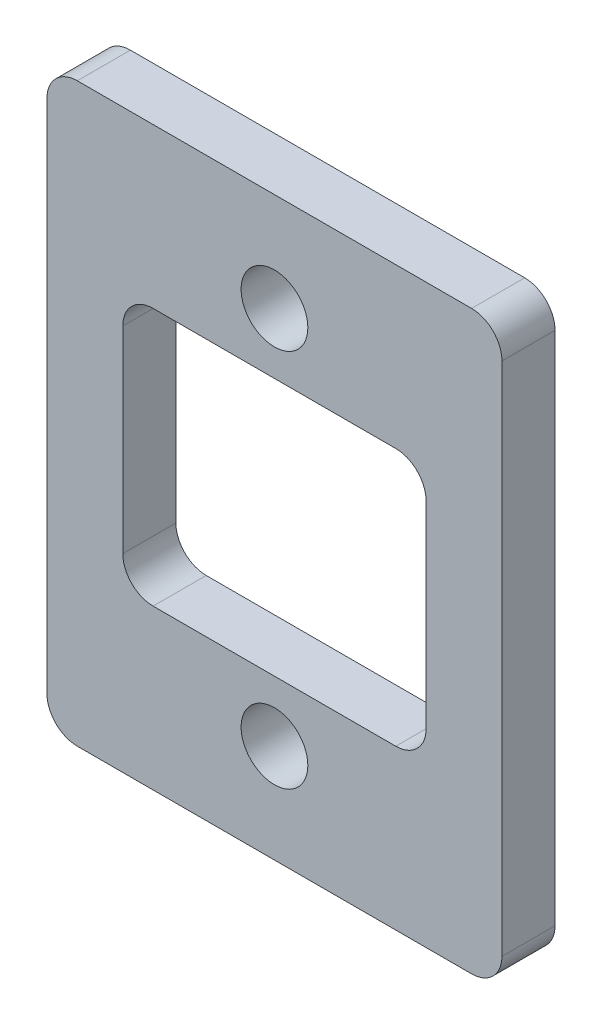
ISO-10303-21;
HEADER;
FILE_DESCRIPTION(('STEP AP214'),'2;1');
FILE_NAME('part.step','',(''),(''),'','','');
FILE_SCHEMA(('AUTOMOTIVE_DESIGN { 1 0 10303 214 1 1 1 1 }'));
ENDSEC;
DATA;
#1=APPLICATION_CONTEXT('core data for automotive mechanical design processes');
#2=APPLICATION_PROTOCOL_DEFINITION('international standard','automotive_design',2000,#1);
#3=PRODUCT_CONTEXT('',#1,'mechanical');
#4=PRODUCT('Part','Part','',(#3));
#5=PRODUCT_RELATED_PRODUCT_CATEGORY('part','',(#4));
#6=PRODUCT_DEFINITION_FORMATION('','',#4);
#7=PRODUCT_DEFINITION_CONTEXT('part definition',#1,'design');
#8=PRODUCT_DEFINITION('design','',#6,#7);
#9=PRODUCT_DEFINITION_SHAPE('','',#8);
#10=(LENGTH_UNIT() NAMED_UNIT(*) SI_UNIT(.MILLI.,.METRE.));
#11=(NAMED_UNIT(*) PLANE_ANGLE_UNIT() SI_UNIT($,.RADIAN.));
#12=(NAMED_UNIT(*) SI_UNIT($,.STERADIAN.) SOLID_ANGLE_UNIT());
#13=UNCERTAINTY_MEASURE_WITH_UNIT(LENGTH_MEASURE(1.E-05),#10,'distance_accuracy_value','');
#14=(GEOMETRIC_REPRESENTATION_CONTEXT(3) GLOBAL_UNCERTAINTY_ASSIGNED_CONTEXT((#13)) GLOBAL_UNIT_ASSIGNED_CONTEXT((#10,
#11,#12)) REPRESENTATION_CONTEXT('',''));
#15=CARTESIAN_POINT('',(0.,0.,0.));
#16=DIRECTION('',(0.,0.,1.));
#17=DIRECTION('',(1.,0.,0.));
#18=AXIS2_PLACEMENT_3D('',#15,#16,#17);
#19=CARTESIAN_POINT('',(0.,0.,3.5));
#20=DIRECTION('',(0.,0.,-1.));
#21=DIRECTION('',(-1.,0.,0.));
#22=AXIS2_PLACEMENT_3D('',#19,#20,#21);
#23=PLANE('',#22);
#24=DIRECTION('',(-1.,0.,0.));
#25=VECTOR('',#24,1.);
#26=CARTESIAN_POINT('',(-10.,8.5,3.5));
#27=LINE('',#26,#25);
#28=CARTESIAN_POINT('',(8.,8.5,3.5));
#29=VERTEX_POINT('',#28);
#30=CARTESIAN_POINT('',(-8.,8.5,3.5));
#31=VERTEX_POINT('',#30);
#32=EDGE_CURVE('E294',#29,#31,#27,.T.);
#33=ORIENTED_EDGE('',*,*,#32,.F.);
#34=CARTESIAN_POINT('',(8.,6.5,3.5));
#35=DIRECTION('',(0.,0.,-1.));
#36=DIRECTION('',(-1.,0.,0.));
#37=AXIS2_PLACEMENT_3D('',#34,#35,#36);
#38=CIRCLE('',#37,2.);
#39=CARTESIAN_POINT('',(10.,6.5,3.5));
#40=VERTEX_POINT('',#39);
#41=EDGE_CURVE('E252',#29,#40,#38,.T.);
#42=ORIENTED_EDGE('',*,*,#41,.T.);
#43=DIRECTION('',(0.,1.,0.));
#44=VECTOR('',#43,1.);
#45=CARTESIAN_POINT('',(10.,-8.5,3.5));
#46=LINE('',#45,#44);
#47=CARTESIAN_POINT('',(10.,-6.5,3.5));
#48=VERTEX_POINT('',#47);
#49=EDGE_CURVE('E266',#48,#40,#46,.T.);
#50=ORIENTED_EDGE('',*,*,#49,.F.);
#51=CARTESIAN_POINT('',(8.,-6.5,3.5));
#52=DIRECTION('',(0.,0.,-1.));
#53=DIRECTION('',(-1.,0.,0.));
#54=AXIS2_PLACEMENT_3D('',#51,#52,#53);
#55=CIRCLE('',#54,2.);
#56=CARTESIAN_POINT('',(8.,-8.5,3.5));
#57=VERTEX_POINT('',#56);
#58=EDGE_CURVE('E43',#48,#57,#55,.T.);
#59=ORIENTED_EDGE('',*,*,#58,.T.);
#60=DIRECTION('',(1.,0.,0.));
#61=VECTOR('',#60,1.);
#62=CARTESIAN_POINT('',(-9.99999999999999,-8.5,3.5));
#63=LINE('',#62,#61);
#64=CARTESIAN_POINT('',(-7.99999999999999,-8.5,3.5));
#65=VERTEX_POINT('',#64);
#66=EDGE_CURVE('E264',#65,#57,#63,.T.);
#67=ORIENTED_EDGE('',*,*,#66,.F.);
#68=CARTESIAN_POINT('',(-7.99999999999999,-6.5,3.5));
#69=DIRECTION('',(0.,0.,-1.));
#70=DIRECTION('',(-1.,0.,0.));
#71=AXIS2_PLACEMENT_3D('',#68,#69,#70);
#72=CIRCLE('',#71,2.);
#73=CARTESIAN_POINT('',(-9.99999999999999,-6.5,3.5));
#74=VERTEX_POINT('',#73);
#75=EDGE_CURVE('E256',#65,#74,#72,.T.);
#76=ORIENTED_EDGE('',*,*,#75,.T.);
#77=DIRECTION('',(0.,-1.,0.));
#78=VECTOR('',#77,1.);
#79=CARTESIAN_POINT('',(-9.99999999999999,-8.5,3.5));
#80=LINE('',#79,#78);
#81=CARTESIAN_POINT('',(-10.,6.5,3.5));
#82=VERTEX_POINT('',#81);
#83=EDGE_CURVE('E275',#82,#74,#80,.T.);
#84=ORIENTED_EDGE('',*,*,#83,.F.);
#85=CARTESIAN_POINT('',(-8.,6.5,3.5));
#86=DIRECTION('',(0.,0.,-1.));
#87=DIRECTION('',(-1.,0.,0.));
#88=AXIS2_PLACEMENT_3D('',#85,#86,#87);
#89=CIRCLE('',#88,2.);
#90=EDGE_CURVE('E248',#82,#31,#89,.T.);
#91=ORIENTED_EDGE('',*,*,#90,.T.);
#92=EDGE_LOOP('',(#33,#42,#50,#59,#67,#76,#84,#91));
#93=FACE_BOUND('',#92,.T.);
#94=DIRECTION('',(1.,0.,0.));
#95=VECTOR('',#94,1.);
#96=CARTESIAN_POINT('',(-15.,-19.,3.5));
#97=LINE('',#96,#95);
#98=CARTESIAN_POINT('',(-13.,-19.,3.5));
#99=VERTEX_POINT('',#98);
#100=CARTESIAN_POINT('',(13.,-19.,3.5));
#101=VERTEX_POINT('',#100);
#102=EDGE_CURVE('E186',#99,#101,#97,.T.);
#103=ORIENTED_EDGE('',*,*,#102,.T.);
#104=CARTESIAN_POINT('',(13.,-17.,3.5));
#105=DIRECTION('',(0.,0.,-1.));
#106=DIRECTION('',(-1.,0.,0.));
#107=AXIS2_PLACEMENT_3D('',#104,#105,#106);
#108=CIRCLE('',#107,2.);
#109=CARTESIAN_POINT('',(15.,-17.,3.5));
#110=VERTEX_POINT('',#109);
#111=EDGE_CURVE('E217',#101,#110,#108,.F.);
#112=ORIENTED_EDGE('',*,*,#111,.T.);
#113=DIRECTION('',(0.,1.,0.));
#114=VECTOR('',#113,1.);
#115=CARTESIAN_POINT('',(15.,-19.,3.5));
#116=LINE('',#115,#114);
#117=CARTESIAN_POINT('',(15.,17.,3.5));
#118=VERTEX_POINT('',#117);
#119=EDGE_CURVE('E169',#110,#118,#116,.T.);
#120=ORIENTED_EDGE('',*,*,#119,.T.);
#121=CARTESIAN_POINT('',(13.,17.,3.5));
#122=DIRECTION('',(0.,0.,-1.));
#123=DIRECTION('',(-1.,0.,0.));
#124=AXIS2_PLACEMENT_3D('',#121,#122,#123);
#125=CIRCLE('',#124,2.);
#126=CARTESIAN_POINT('',(13.,19.,3.5));
#127=VERTEX_POINT('',#126);
#128=EDGE_CURVE('E212',#118,#127,#125,.F.);
#129=ORIENTED_EDGE('',*,*,#128,.T.);
#130=DIRECTION('',(-1.,0.,0.));
#131=VECTOR('',#130,1.);
#132=CARTESIAN_POINT('',(-15.,19.,3.5));
#133=LINE('',#132,#131);
#134=CARTESIAN_POINT('',(-13.,19.,3.5));
#135=VERTEX_POINT('',#134);
#136=EDGE_CURVE('E319',#127,#135,#133,.T.);
#137=ORIENTED_EDGE('',*,*,#136,.T.);
#138=CARTESIAN_POINT('',(-13.,17.,3.5));
#139=DIRECTION('',(0.,0.,-1.));
#140=DIRECTION('',(-1.,0.,0.));
#141=AXIS2_PLACEMENT_3D('',#138,#139,#140);
#142=CIRCLE('',#141,2.);
#143=CARTESIAN_POINT('',(-15.,17.,3.5));
#144=VERTEX_POINT('',#143);
#145=EDGE_CURVE('E57',#135,#144,#142,.F.);
#146=ORIENTED_EDGE('',*,*,#145,.T.);
#147=DIRECTION('',(0.,-1.,0.));
#148=VECTOR('',#147,1.);
#149=CARTESIAN_POINT('',(-15.,-19.,3.5));
#150=LINE('',#149,#148);
#151=CARTESIAN_POINT('',(-15.,-17.,3.5));
#152=VERTEX_POINT('',#151);
#153=EDGE_CURVE('E320',#144,#152,#150,.T.);
#154=ORIENTED_EDGE('',*,*,#153,.T.);
#155=CARTESIAN_POINT('',(-13.,-17.,3.5));
#156=DIRECTION('',(0.,0.,-1.));
#157=DIRECTION('',(-1.,0.,0.));
#158=AXIS2_PLACEMENT_3D('',#155,#156,#157);
#159=CIRCLE('',#158,2.);
#160=EDGE_CURVE('E215',#152,#99,#159,.F.);
#161=ORIENTED_EDGE('',*,*,#160,.T.);
#162=EDGE_LOOP('',(#103,#112,#120,#129,#137,#146,#154,#161));
#163=FACE_BOUND('',#162,.T.);
#164=CARTESIAN_POINT('',(0.,12.5,3.5));
#165=DIRECTION('',(0.,0.,1.));
#166=DIRECTION('',(1.,0.,0.));
#167=AXIS2_PLACEMENT_3D('',#164,#165,#166);
#168=CIRCLE('',#167,2.2);
#169=CARTESIAN_POINT('',(2.2,12.5,3.5));
#170=VERTEX_POINT('',#169);
#171=EDGE_CURVE('E177',#170,#170,#168,.T.);
#172=ORIENTED_EDGE('',*,*,#171,.F.);
#173=EDGE_LOOP('',(#172));
#174=FACE_BOUND('',#173,.T.);
#175=CARTESIAN_POINT('',(0.,-12.5,3.5));
#176=DIRECTION('',(0.,0.,1.));
#177=DIRECTION('',(1.,0.,0.));
#178=AXIS2_PLACEMENT_3D('',#175,#176,#177);
#179=CIRCLE('',#178,2.2);
#180=CARTESIAN_POINT('',(2.2,-12.5,3.5));
#181=VERTEX_POINT('',#180);
#182=EDGE_CURVE('E311',#181,#181,#179,.T.);
#183=ORIENTED_EDGE('',*,*,#182,.F.);
#184=EDGE_LOOP('',(#183));
#185=FACE_BOUND('',#184,.T.);
#186=ADVANCED_FACE('F35',(#93,#163,#174,#185),#23,.F.);
#187=CARTESIAN_POINT('',(0.,0.,0.));
#188=DIRECTION('',(0.,0.,-1.));
#189=DIRECTION('',(-1.,0.,0.));
#190=AXIS2_PLACEMENT_3D('',#187,#188,#189);
#191=PLANE('',#190);
#192=DIRECTION('',(0.,-1.,0.));
#193=VECTOR('',#192,1.);
#194=CARTESIAN_POINT('',(10.,0.,0.));
#195=LINE('',#194,#193);
#196=CARTESIAN_POINT('',(10.,6.5,0.));
#197=VERTEX_POINT('',#196);
#198=CARTESIAN_POINT('',(10.,-6.5,0.));
#199=VERTEX_POINT('',#198);
#200=EDGE_CURVE('E201',#197,#199,#195,.T.);
#201=ORIENTED_EDGE('',*,*,#200,.F.);
#202=CARTESIAN_POINT('',(8.,6.5,0.));
#203=DIRECTION('',(0.,0.,-1.));
#204=DIRECTION('',(-1.,0.,0.));
#205=AXIS2_PLACEMENT_3D('',#202,#203,#204);
#206=CIRCLE('',#205,2.);
#207=CARTESIAN_POINT('',(8.,8.5,0.));
#208=VERTEX_POINT('',#207);
#209=EDGE_CURVE('E254',#197,#208,#206,.F.);
#210=ORIENTED_EDGE('',*,*,#209,.T.);
#211=DIRECTION('',(1.,0.,0.));
#212=VECTOR('',#211,1.);
#213=CARTESIAN_POINT('',(0.,8.5,0.));
#214=LINE('',#213,#212);
#215=CARTESIAN_POINT('',(-8.,8.5,0.));
#216=VERTEX_POINT('',#215);
#217=EDGE_CURVE('E192',#216,#208,#214,.T.);
#218=ORIENTED_EDGE('',*,*,#217,.F.);
#219=CARTESIAN_POINT('',(-8.,6.5,0.));
#220=DIRECTION('',(0.,0.,-1.));
#221=DIRECTION('',(-1.,0.,0.));
#222=AXIS2_PLACEMENT_3D('',#219,#220,#221);
#223=CIRCLE('',#222,2.);
#224=CARTESIAN_POINT('',(-10.,6.5,0.));
#225=VERTEX_POINT('',#224);
#226=EDGE_CURVE('E250',#216,#225,#223,.F.);
#227=ORIENTED_EDGE('',*,*,#226,.T.);
#228=DIRECTION('',(0.,1.,0.));
#229=VECTOR('',#228,1.);
#230=CARTESIAN_POINT('',(-10.,0.,0.));
#231=LINE('',#230,#229);
#232=CARTESIAN_POINT('',(-9.99999999999999,-6.5,0.));
#233=VERTEX_POINT('',#232);
#234=EDGE_CURVE('E195',#233,#225,#231,.T.);
#235=ORIENTED_EDGE('',*,*,#234,.F.);
#236=CARTESIAN_POINT('',(-7.99999999999999,-6.5,0.));
#237=DIRECTION('',(0.,0.,-1.));
#238=DIRECTION('',(-1.,0.,0.));
#239=AXIS2_PLACEMENT_3D('',#236,#237,#238);
#240=CIRCLE('',#239,2.);
#241=CARTESIAN_POINT('',(-7.99999999999999,-8.5,0.));
#242=VERTEX_POINT('',#241);
#243=EDGE_CURVE('E258',#233,#242,#240,.F.);
#244=ORIENTED_EDGE('',*,*,#243,.T.);
#245=DIRECTION('',(-1.,0.,0.));
#246=VECTOR('',#245,1.);
#247=CARTESIAN_POINT('',(0.,-8.5,0.));
#248=LINE('',#247,#246);
#249=CARTESIAN_POINT('',(8.,-8.5,0.));
#250=VERTEX_POINT('',#249);
#251=EDGE_CURVE('E198',#250,#242,#248,.T.);
#252=ORIENTED_EDGE('',*,*,#251,.F.);
#253=CARTESIAN_POINT('',(8.,-6.5,0.));
#254=DIRECTION('',(0.,0.,-1.));
#255=DIRECTION('',(-1.,0.,0.));
#256=AXIS2_PLACEMENT_3D('',#253,#254,#255);
#257=CIRCLE('',#256,2.);
#258=EDGE_CURVE('E11',#250,#199,#257,.F.);
#259=ORIENTED_EDGE('',*,*,#258,.T.);
#260=EDGE_LOOP('',(#201,#210,#218,#227,#235,#244,#252,#259));
#261=FACE_BOUND('',#260,.T.);
#262=CARTESIAN_POINT('',(0.,12.5,0.));
#263=DIRECTION('',(0.,0.,1.));
#264=DIRECTION('',(1.,0.,0.));
#265=AXIS2_PLACEMENT_3D('',#262,#263,#264);
#266=CIRCLE('',#265,2.2);
#267=CARTESIAN_POINT('',(2.2,12.5,0.));
#268=VERTEX_POINT('',#267);
#269=EDGE_CURVE('E183',#268,#268,#266,.T.);
#270=ORIENTED_EDGE('',*,*,#269,.T.);
#271=EDGE_LOOP('',(#270));
#272=FACE_BOUND('',#271,.T.);
#273=DIRECTION('',(0.,1.,0.));
#274=VECTOR('',#273,1.);
#275=CARTESIAN_POINT('',(15.,-19.,0.));
#276=LINE('',#275,#274);
#277=CARTESIAN_POINT('',(15.,-17.,0.));
#278=VERTEX_POINT('',#277);
#279=CARTESIAN_POINT('',(15.,17.,0.));
#280=VERTEX_POINT('',#279);
#281=EDGE_CURVE('E166',#278,#280,#276,.T.);
#282=ORIENTED_EDGE('',*,*,#281,.F.);
#283=CARTESIAN_POINT('',(13.,-17.,0.));
#284=DIRECTION('',(0.,0.,-1.));
#285=DIRECTION('',(-1.,0.,0.));
#286=AXIS2_PLACEMENT_3D('',#283,#284,#285);
#287=CIRCLE('',#286,2.);
#288=CARTESIAN_POINT('',(13.,-19.,0.));
#289=VERTEX_POINT('',#288);
#290=EDGE_CURVE('E149',#278,#289,#287,.T.);
#291=ORIENTED_EDGE('',*,*,#290,.T.);
#292=DIRECTION('',(1.,0.,0.));
#293=VECTOR('',#292,1.);
#294=CARTESIAN_POINT('',(-15.,-19.,0.));
#295=LINE('',#294,#293);
#296=CARTESIAN_POINT('',(-13.,-19.,0.));
#297=VERTEX_POINT('',#296);
#298=EDGE_CURVE('E190',#297,#289,#295,.T.);
#299=ORIENTED_EDGE('',*,*,#298,.F.);
#300=CARTESIAN_POINT('',(-13.,-17.,0.));
#301=DIRECTION('',(0.,0.,-1.));
#302=DIRECTION('',(-1.,0.,0.));
#303=AXIS2_PLACEMENT_3D('',#300,#301,#302);
#304=CIRCLE('',#303,2.);
#305=CARTESIAN_POINT('',(-15.,-17.,0.));
#306=VERTEX_POINT('',#305);
#307=EDGE_CURVE('E160',#297,#306,#304,.T.);
#308=ORIENTED_EDGE('',*,*,#307,.T.);
#309=DIRECTION('',(0.,-1.,0.));
#310=VECTOR('',#309,1.);
#311=CARTESIAN_POINT('',(-15.,-19.,0.));
#312=LINE('',#311,#310);
#313=CARTESIAN_POINT('',(-15.,17.,0.));
#314=VERTEX_POINT('',#313);
#315=EDGE_CURVE('E180',#314,#306,#312,.T.);
#316=ORIENTED_EDGE('',*,*,#315,.F.);
#317=CARTESIAN_POINT('',(-13.,17.,0.));
#318=DIRECTION('',(0.,0.,-1.));
#319=DIRECTION('',(-1.,0.,0.));
#320=AXIS2_PLACEMENT_3D('',#317,#318,#319);
#321=CIRCLE('',#320,2.);
#322=CARTESIAN_POINT('',(-13.,19.,0.));
#323=VERTEX_POINT('',#322);
#324=EDGE_CURVE('E206',#314,#323,#321,.T.);
#325=ORIENTED_EDGE('',*,*,#324,.T.);
#326=DIRECTION('',(-1.,0.,0.));
#327=VECTOR('',#326,1.);
#328=CARTESIAN_POINT('',(-15.,19.,0.));
#329=LINE('',#328,#327);
#330=CARTESIAN_POINT('',(13.,19.,0.));
#331=VERTEX_POINT('',#330);
#332=EDGE_CURVE('E176',#331,#323,#329,.T.);
#333=ORIENTED_EDGE('',*,*,#332,.F.);
#334=CARTESIAN_POINT('',(13.,17.,0.));
#335=DIRECTION('',(0.,0.,-1.));
#336=DIRECTION('',(-1.,0.,0.));
#337=AXIS2_PLACEMENT_3D('',#334,#335,#336);
#338=CIRCLE('',#337,2.);
#339=EDGE_CURVE('E170',#331,#280,#338,.T.);
#340=ORIENTED_EDGE('',*,*,#339,.T.);
#341=EDGE_LOOP('',(#282,#291,#299,#308,#316,#325,#333,#340));
#342=FACE_BOUND('',#341,.T.);
#343=CARTESIAN_POINT('',(0.,-12.5,0.));
#344=DIRECTION('',(0.,0.,1.));
#345=DIRECTION('',(1.,0.,0.));
#346=AXIS2_PLACEMENT_3D('',#343,#344,#345);
#347=CIRCLE('',#346,2.2);
#348=CARTESIAN_POINT('',(2.2,-12.5,0.));
#349=VERTEX_POINT('',#348);
#350=EDGE_CURVE('E274',#349,#349,#347,.T.);
#351=ORIENTED_EDGE('',*,*,#350,.T.);
#352=EDGE_LOOP('',(#351));
#353=FACE_BOUND('',#352,.T.);
#354=ADVANCED_FACE('F173',(#261,#272,#342,#353),#191,.T.);
#355=CARTESIAN_POINT('',(15.,-19.,3.5));
#356=DIRECTION('',(-1.,0.,0.));
#357=DIRECTION('',(0.,0.,1.));
#358=AXIS2_PLACEMENT_3D('',#355,#356,#357);
#359=PLANE('',#358);
#360=ORIENTED_EDGE('',*,*,#119,.F.);
#361=DIRECTION('',(0.,0.,-1.));
#362=VECTOR('',#361,1.);
#363=CARTESIAN_POINT('',(15.,-17.,3.5));
#364=LINE('',#363,#362);
#365=EDGE_CURVE('E153',#110,#278,#364,.T.);
#366=ORIENTED_EDGE('',*,*,#365,.T.);
#367=ORIENTED_EDGE('',*,*,#281,.T.);
#368=DIRECTION('',(0.,0.,-1.));
#369=VECTOR('',#368,1.);
#370=CARTESIAN_POINT('',(15.,17.,3.5));
#371=LINE('',#370,#369);
#372=EDGE_CURVE('E171',#280,#118,#371,.F.);
#373=ORIENTED_EDGE('',*,*,#372,.T.);
#374=EDGE_LOOP('',(#360,#366,#367,#373));
#375=FACE_BOUND('',#374,.T.);
#376=ADVANCED_FACE('F165',(#375),#359,.F.);
#377=CARTESIAN_POINT('',(-15.,19.,3.5));
#378=DIRECTION('',(0.,-1.,0.));
#379=DIRECTION('',(0.,0.,-1.));
#380=AXIS2_PLACEMENT_3D('',#377,#378,#379);
#381=PLANE('',#380);
#382=ORIENTED_EDGE('',*,*,#332,.T.);
#383=DIRECTION('',(0.,0.,-1.));
#384=VECTOR('',#383,1.);
#385=CARTESIAN_POINT('',(-13.,19.,3.5));
#386=LINE('',#385,#384);
#387=EDGE_CURVE('E226',#323,#135,#386,.F.);
#388=ORIENTED_EDGE('',*,*,#387,.T.);
#389=ORIENTED_EDGE('',*,*,#136,.F.);
#390=DIRECTION('',(0.,0.,-1.));
#391=VECTOR('',#390,1.);
#392=CARTESIAN_POINT('',(13.,19.,3.5));
#393=LINE('',#392,#391);
#394=EDGE_CURVE('E223',#127,#331,#393,.T.);
#395=ORIENTED_EDGE('',*,*,#394,.T.);
#396=EDGE_LOOP('',(#382,#388,#389,#395));
#397=FACE_BOUND('',#396,.T.);
#398=ADVANCED_FACE('F337',(#397),#381,.F.);
#399=CARTESIAN_POINT('',(-15.,-19.,3.5));
#400=DIRECTION('',(1.,0.,0.));
#401=DIRECTION('',(0.,0.,-1.));
#402=AXIS2_PLACEMENT_3D('',#399,#400,#401);
#403=PLANE('',#402);
#404=ORIENTED_EDGE('',*,*,#315,.T.);
#405=DIRECTION('',(0.,0.,-1.));
#406=VECTOR('',#405,1.);
#407=CARTESIAN_POINT('',(-15.,-17.,3.5));
#408=LINE('',#407,#406);
#409=EDGE_CURVE('E50',#306,#152,#408,.F.);
#410=ORIENTED_EDGE('',*,*,#409,.T.);
#411=ORIENTED_EDGE('',*,*,#153,.F.);
#412=DIRECTION('',(0.,0.,-1.));
#413=VECTOR('',#412,1.);
#414=CARTESIAN_POINT('',(-15.,17.,3.5));
#415=LINE('',#414,#413);
#416=EDGE_CURVE('E219',#144,#314,#415,.T.);
#417=ORIENTED_EDGE('',*,*,#416,.T.);
#418=EDGE_LOOP('',(#404,#410,#411,#417));
#419=FACE_BOUND('',#418,.T.);
#420=ADVANCED_FACE('F331',(#419),#403,.F.);
#421=CARTESIAN_POINT('',(-15.,-19.,3.5));
#422=DIRECTION('',(0.,1.,0.));
#423=DIRECTION('',(0.,0.,1.));
#424=AXIS2_PLACEMENT_3D('',#421,#422,#423);
#425=PLANE('',#424);
#426=ORIENTED_EDGE('',*,*,#298,.T.);
#427=DIRECTION('',(0.,0.,-1.));
#428=VECTOR('',#427,1.);
#429=CARTESIAN_POINT('',(13.,-19.,3.5));
#430=LINE('',#429,#428);
#431=EDGE_CURVE('E154',#289,#101,#430,.F.);
#432=ORIENTED_EDGE('',*,*,#431,.T.);
#433=ORIENTED_EDGE('',*,*,#102,.F.);
#434=DIRECTION('',(0.,0.,-1.));
#435=VECTOR('',#434,1.);
#436=CARTESIAN_POINT('',(-13.,-19.,3.5));
#437=LINE('',#436,#435);
#438=EDGE_CURVE('E159',#99,#297,#437,.T.);
#439=ORIENTED_EDGE('',*,*,#438,.T.);
#440=EDGE_LOOP('',(#426,#432,#433,#439));
#441=FACE_BOUND('',#440,.T.);
#442=ADVANCED_FACE('F327',(#441),#425,.F.);
#443=CARTESIAN_POINT('',(0.,12.5,3.5));
#444=DIRECTION('',(0.,0.,-1.));
#445=DIRECTION('',(-1.,0.,0.));
#446=AXIS2_PLACEMENT_3D('',#443,#444,#445);
#447=CYLINDRICAL_SURFACE('',#446,2.2);
#448=ORIENTED_EDGE('',*,*,#171,.T.);
#449=EDGE_LOOP('',(#448));
#450=FACE_BOUND('',#449,.T.);
#451=ORIENTED_EDGE('',*,*,#269,.F.);
#452=EDGE_LOOP('',(#451));
#453=FACE_BOUND('',#452,.T.);
#454=ADVANCED_FACE('F359',(#450,#453),#447,.F.);
#455=CARTESIAN_POINT('',(0.,-12.5,3.5));
#456=DIRECTION('',(0.,0.,-1.));
#457=DIRECTION('',(-1.,0.,0.));
#458=AXIS2_PLACEMENT_3D('',#455,#456,#457);
#459=CYLINDRICAL_SURFACE('',#458,2.2);
#460=ORIENTED_EDGE('',*,*,#182,.T.);
#461=EDGE_LOOP('',(#460));
#462=FACE_BOUND('',#461,.T.);
#463=ORIENTED_EDGE('',*,*,#350,.F.);
#464=EDGE_LOOP('',(#463));
#465=FACE_BOUND('',#464,.T.);
#466=ADVANCED_FACE('F450',(#462,#465),#459,.F.);
#467=CARTESIAN_POINT('',(10.,-8.5,-6.5));
#468=DIRECTION('',(1.,0.,0.));
#469=DIRECTION('',(0.,0.,-1.));
#470=AXIS2_PLACEMENT_3D('',#467,#468,#469);
#471=PLANE('',#470);
#472=ORIENTED_EDGE('',*,*,#49,.T.);
#473=DIRECTION('',(0.,0.,1.));
#474=VECTOR('',#473,1.);
#475=CARTESIAN_POINT('',(10.,6.5,0.));
#476=LINE('',#475,#474);
#477=EDGE_CURVE('E241',#40,#197,#476,.F.);
#478=ORIENTED_EDGE('',*,*,#477,.T.);
#479=ORIENTED_EDGE('',*,*,#200,.T.);
#480=DIRECTION('',(0.,0.,1.));
#481=VECTOR('',#480,1.);
#482=CARTESIAN_POINT('',(10.,-6.5,3.5));
#483=LINE('',#482,#481);
#484=EDGE_CURVE('E238',#199,#48,#483,.T.);
#485=ORIENTED_EDGE('',*,*,#484,.T.);
#486=EDGE_LOOP('',(#472,#478,#479,#485));
#487=FACE_BOUND('',#486,.T.);
#488=ADVANCED_FACE('F283',(#487),#471,.F.);
#489=CARTESIAN_POINT('',(-9.99999999999999,-8.5,-6.5));
#490=DIRECTION('',(0.,-1.,0.));
#491=DIRECTION('',(1.,0.,0.));
#492=AXIS2_PLACEMENT_3D('',#489,#490,#491);
#493=PLANE('',#492);
#494=ORIENTED_EDGE('',*,*,#251,.T.);
#495=DIRECTION('',(0.,0.,1.));
#496=VECTOR('',#495,1.);
#497=CARTESIAN_POINT('',(-7.99999999999999,-8.5,3.5));
#498=LINE('',#497,#496);
#499=EDGE_CURVE('E245',#242,#65,#498,.T.);
#500=ORIENTED_EDGE('',*,*,#499,.T.);
#501=ORIENTED_EDGE('',*,*,#66,.T.);
#502=DIRECTION('',(0.,0.,1.));
#503=VECTOR('',#502,1.);
#504=CARTESIAN_POINT('',(8.,-8.5,0.));
#505=LINE('',#504,#503);
#506=EDGE_CURVE('E243',#57,#250,#505,.F.);
#507=ORIENTED_EDGE('',*,*,#506,.T.);
#508=EDGE_LOOP('',(#494,#500,#501,#507));
#509=FACE_BOUND('',#508,.T.);
#510=ADVANCED_FACE('F271',(#509),#493,.F.);
#511=CARTESIAN_POINT('',(-9.99999999999999,-8.5,-6.5));
#512=DIRECTION('',(-1.,0.,0.));
#513=DIRECTION('',(0.,-1.,0.));
#514=AXIS2_PLACEMENT_3D('',#511,#512,#513);
#515=PLANE('',#514);
#516=ORIENTED_EDGE('',*,*,#234,.T.);
#517=DIRECTION('',(0.,0.,1.));
#518=VECTOR('',#517,1.);
#519=CARTESIAN_POINT('',(-10.,6.5,3.5));
#520=LINE('',#519,#518);
#521=EDGE_CURVE('E230',#225,#82,#520,.T.);
#522=ORIENTED_EDGE('',*,*,#521,.T.);
#523=ORIENTED_EDGE('',*,*,#83,.T.);
#524=DIRECTION('',(0.,0.,1.));
#525=VECTOR('',#524,1.);
#526=CARTESIAN_POINT('',(-9.99999999999999,-6.5,0.));
#527=LINE('',#526,#525);
#528=EDGE_CURVE('E228',#74,#233,#527,.F.);
#529=ORIENTED_EDGE('',*,*,#528,.T.);
#530=EDGE_LOOP('',(#516,#522,#523,#529));
#531=FACE_BOUND('',#530,.T.);
#532=ADVANCED_FACE('F301',(#531),#515,.F.);
#533=CARTESIAN_POINT('',(-10.,8.5,-6.5));
#534=DIRECTION('',(0.,1.,0.));
#535=DIRECTION('',(-1.,0.,0.));
#536=AXIS2_PLACEMENT_3D('',#533,#534,#535);
#537=PLANE('',#536);
#538=ORIENTED_EDGE('',*,*,#32,.T.);
#539=DIRECTION('',(0.,0.,1.));
#540=VECTOR('',#539,1.);
#541=CARTESIAN_POINT('',(-8.,8.5,0.));
#542=LINE('',#541,#540);
#543=EDGE_CURVE('E236',#31,#216,#542,.F.);
#544=ORIENTED_EDGE('',*,*,#543,.T.);
#545=ORIENTED_EDGE('',*,*,#217,.T.);
#546=DIRECTION('',(0.,0.,1.));
#547=VECTOR('',#546,1.);
#548=CARTESIAN_POINT('',(8.,8.5,3.5));
#549=LINE('',#548,#547);
#550=EDGE_CURVE('E233',#208,#29,#549,.T.);
#551=ORIENTED_EDGE('',*,*,#550,.T.);
#552=EDGE_LOOP('',(#538,#544,#545,#551));
#553=FACE_BOUND('',#552,.T.);
#554=ADVANCED_FACE('F292',(#553),#537,.F.);
#555=CARTESIAN_POINT('',(13.,-17.,3.5));
#556=DIRECTION('',(0.,0.,-1.));
#557=DIRECTION('',(-1.,0.,0.));
#558=AXIS2_PLACEMENT_3D('',#555,#556,#557);
#559=CYLINDRICAL_SURFACE('',#558,2.);
#560=ORIENTED_EDGE('',*,*,#111,.F.);
#561=ORIENTED_EDGE('',*,*,#431,.F.);
#562=ORIENTED_EDGE('',*,*,#290,.F.);
#563=ORIENTED_EDGE('',*,*,#365,.F.);
#564=EDGE_LOOP('',(#560,#561,#562,#563));
#565=FACE_BOUND('',#564,.T.);
#566=ADVANCED_FACE('F152',(#565),#559,.T.);
#567=CARTESIAN_POINT('',(-13.,-17.,3.5));
#568=DIRECTION('',(0.,0.,-1.));
#569=DIRECTION('',(-1.,0.,0.));
#570=AXIS2_PLACEMENT_3D('',#567,#568,#569);
#571=CYLINDRICAL_SURFACE('',#570,2.);
#572=ORIENTED_EDGE('',*,*,#160,.F.);
#573=ORIENTED_EDGE('',*,*,#409,.F.);
#574=ORIENTED_EDGE('',*,*,#307,.F.);
#575=ORIENTED_EDGE('',*,*,#438,.F.);
#576=EDGE_LOOP('',(#572,#573,#574,#575));
#577=FACE_BOUND('',#576,.T.);
#578=ADVANCED_FACE('F329',(#577),#571,.T.);
#579=CARTESIAN_POINT('',(-13.,17.,3.5));
#580=DIRECTION('',(0.,0.,-1.));
#581=DIRECTION('',(-1.,0.,0.));
#582=AXIS2_PLACEMENT_3D('',#579,#580,#581);
#583=CYLINDRICAL_SURFACE('',#582,2.);
#584=ORIENTED_EDGE('',*,*,#145,.F.);
#585=ORIENTED_EDGE('',*,*,#387,.F.);
#586=ORIENTED_EDGE('',*,*,#324,.F.);
#587=ORIENTED_EDGE('',*,*,#416,.F.);
#588=EDGE_LOOP('',(#584,#585,#586,#587));
#589=FACE_BOUND('',#588,.T.);
#590=ADVANCED_FACE('F334',(#589),#583,.T.);
#591=CARTESIAN_POINT('',(13.,17.,3.5));
#592=DIRECTION('',(0.,0.,-1.));
#593=DIRECTION('',(-1.,0.,0.));
#594=AXIS2_PLACEMENT_3D('',#591,#592,#593);
#595=CYLINDRICAL_SURFACE('',#594,2.);
#596=ORIENTED_EDGE('',*,*,#128,.F.);
#597=ORIENTED_EDGE('',*,*,#372,.F.);
#598=ORIENTED_EDGE('',*,*,#339,.F.);
#599=ORIENTED_EDGE('',*,*,#394,.F.);
#600=EDGE_LOOP('',(#596,#597,#598,#599));
#601=FACE_BOUND('',#600,.T.);
#602=ADVANCED_FACE('F342',(#601),#595,.T.);
#603=CARTESIAN_POINT('',(-8.,6.5,-6.5));
#604=DIRECTION('',(0.,0.,-1.));
#605=DIRECTION('',(-1.,0.,0.));
#606=AXIS2_PLACEMENT_3D('',#603,#604,#605);
#607=CYLINDRICAL_SURFACE('',#606,2.);
#608=ORIENTED_EDGE('',*,*,#226,.F.);
#609=ORIENTED_EDGE('',*,*,#543,.F.);
#610=ORIENTED_EDGE('',*,*,#90,.F.);
#611=ORIENTED_EDGE('',*,*,#521,.F.);
#612=EDGE_LOOP('',(#608,#609,#610,#611));
#613=FACE_BOUND('',#612,.T.);
#614=ADVANCED_FACE('F296',(#613),#607,.F.);
#615=CARTESIAN_POINT('',(8.,6.5,-6.5));
#616=DIRECTION('',(0.,0.,-1.));
#617=DIRECTION('',(-1.,0.,0.));
#618=AXIS2_PLACEMENT_3D('',#615,#616,#617);
#619=CYLINDRICAL_SURFACE('',#618,2.);
#620=ORIENTED_EDGE('',*,*,#209,.F.);
#621=ORIENTED_EDGE('',*,*,#477,.F.);
#622=ORIENTED_EDGE('',*,*,#41,.F.);
#623=ORIENTED_EDGE('',*,*,#550,.F.);
#624=EDGE_LOOP('',(#620,#621,#622,#623));
#625=FACE_BOUND('',#624,.T.);
#626=ADVANCED_FACE('F286',(#625),#619,.F.);
#627=CARTESIAN_POINT('',(-7.99999999999999,-6.5,-6.5));
#628=DIRECTION('',(0.,0.,-1.));
#629=DIRECTION('',(-1.,0.,0.));
#630=AXIS2_PLACEMENT_3D('',#627,#628,#629);
#631=CYLINDRICAL_SURFACE('',#630,2.);
#632=ORIENTED_EDGE('',*,*,#243,.F.);
#633=ORIENTED_EDGE('',*,*,#528,.F.);
#634=ORIENTED_EDGE('',*,*,#75,.F.);
#635=ORIENTED_EDGE('',*,*,#499,.F.);
#636=EDGE_LOOP('',(#632,#633,#634,#635));
#637=FACE_BOUND('',#636,.T.);
#638=ADVANCED_FACE('F306',(#637),#631,.F.);
#639=CARTESIAN_POINT('',(8.,-6.5,-6.5));
#640=DIRECTION('',(0.,0.,-1.));
#641=DIRECTION('',(-1.,0.,0.));
#642=AXIS2_PLACEMENT_3D('',#639,#640,#641);
#643=CYLINDRICAL_SURFACE('',#642,2.);
#644=ORIENTED_EDGE('',*,*,#258,.F.);
#645=ORIENTED_EDGE('',*,*,#506,.F.);
#646=ORIENTED_EDGE('',*,*,#58,.F.);
#647=ORIENTED_EDGE('',*,*,#484,.F.);
#648=EDGE_LOOP('',(#644,#645,#646,#647));
#649=FACE_BOUND('',#648,.T.);
#650=ADVANCED_FACE('F37',(#649),#643,.F.);
#651=CLOSED_SHELL('',(#186,#354,#376,#398,#420,#442,#454,#466,#488,#510,#532,#554,#566,#578,
#590,#602,#614,#626,#638,#650));
#652=MANIFOLD_SOLID_BREP('B2',#651);
#653=ADVANCED_BREP_SHAPE_REPRESENTATION('',(#18,#652),#14);
#654=SHAPE_DEFINITION_REPRESENTATION(#9,#653);
ENDSEC;
END-ISO-10303-21;
